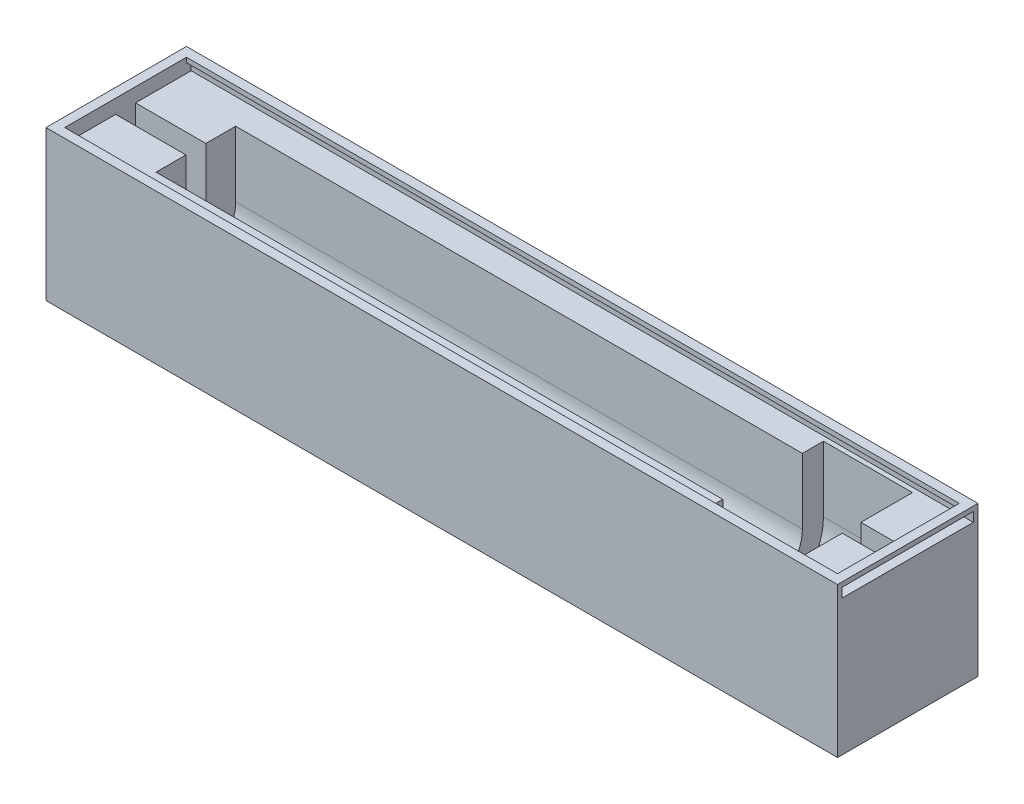
ISO-10303-21;
HEADER;
FILE_DESCRIPTION(('STEP AP214'),'2;1');
FILE_NAME('part.step','',(''),(''),'','','');
FILE_SCHEMA(('AUTOMOTIVE_DESIGN { 1 0 10303 214 1 1 1 1 }'));
ENDSEC;
DATA;
#1=APPLICATION_CONTEXT('core data for automotive mechanical design processes');
#2=APPLICATION_PROTOCOL_DEFINITION('international standard','automotive_design',2000,#1);
#3=PRODUCT_CONTEXT('',#1,'mechanical');
#4=PRODUCT('Part','Part','',(#3));
#5=PRODUCT_RELATED_PRODUCT_CATEGORY('part','',(#4));
#6=PRODUCT_DEFINITION_FORMATION('','',#4);
#7=PRODUCT_DEFINITION_CONTEXT('part definition',#1,'design');
#8=PRODUCT_DEFINITION('design','',#6,#7);
#9=PRODUCT_DEFINITION_SHAPE('','',#8);
#10=(LENGTH_UNIT() NAMED_UNIT(*) SI_UNIT(.MILLI.,.METRE.));
#11=(NAMED_UNIT(*) PLANE_ANGLE_UNIT() SI_UNIT($,.RADIAN.));
#12=(NAMED_UNIT(*) SI_UNIT($,.STERADIAN.) SOLID_ANGLE_UNIT());
#13=UNCERTAINTY_MEASURE_WITH_UNIT(LENGTH_MEASURE(1.E-05),#10,'distance_accuracy_value','');
#14=(GEOMETRIC_REPRESENTATION_CONTEXT(3) GLOBAL_UNCERTAINTY_ASSIGNED_CONTEXT((#13)) GLOBAL_UNIT_ASSIGNED_CONTEXT((#10,
#11,#12)) REPRESENTATION_CONTEXT('',''));
#15=CARTESIAN_POINT('',(0.,0.,0.));
#16=DIRECTION('',(0.,0.,1.));
#17=DIRECTION('',(1.,0.,0.));
#18=AXIS2_PLACEMENT_3D('',#15,#16,#17);
#19=CARTESIAN_POINT('',(0.,0.,0.));
#20=DIRECTION('',(1.,0.,0.));
#21=DIRECTION('',(0.,0.,-1.));
#22=AXIS2_PLACEMENT_3D('',#19,#20,#21);
#23=CYLINDRICAL_SURFACE('',#22,2.125);
#24=CARTESIAN_POINT('',(15.,0.,0.));
#25=DIRECTION('',(1.,0.,0.));
#26=DIRECTION('',(0.,0.,-1.));
#27=AXIS2_PLACEMENT_3D('',#24,#25,#26);
#28=CIRCLE('',#27,2.125);
#29=CARTESIAN_POINT('',(15.,0.,2.125));
#30=VERTEX_POINT('',#29);
#31=CARTESIAN_POINT('',(15.,0.,-2.125));
#32=VERTEX_POINT('',#31);
#33=EDGE_CURVE('E428',#30,#32,#28,.T.);
#34=ORIENTED_EDGE('',*,*,#33,.T.);
#35=DIRECTION('',(1.,0.,0.));
#36=VECTOR('',#35,1.);
#37=CARTESIAN_POINT('',(0.,0.,-2.125));
#38=LINE('',#37,#36);
#39=CARTESIAN_POINT('',(0.,0.,-2.125));
#40=VERTEX_POINT('',#39);
#41=EDGE_CURVE('E441',#40,#32,#38,.T.);
#42=ORIENTED_EDGE('',*,*,#41,.F.);
#43=CARTESIAN_POINT('',(0.,0.,0.));
#44=DIRECTION('',(1.,0.,0.));
#45=DIRECTION('',(0.,0.,-1.));
#46=AXIS2_PLACEMENT_3D('',#43,#44,#45);
#47=CIRCLE('',#46,2.125);
#48=CARTESIAN_POINT('',(0.,0.,2.125));
#49=VERTEX_POINT('',#48);
#50=EDGE_CURVE('E429',#49,#40,#47,.T.);
#51=ORIENTED_EDGE('',*,*,#50,.F.);
#52=DIRECTION('',(1.,0.,0.));
#53=VECTOR('',#52,1.);
#54=CARTESIAN_POINT('',(0.,0.,2.125));
#55=LINE('',#54,#53);
#56=EDGE_CURVE('E451',#49,#30,#55,.T.);
#57=ORIENTED_EDGE('',*,*,#56,.T.);
#58=EDGE_LOOP('',(#34,#42,#51,#57));
#59=FACE_BOUND('',#58,.T.);
#60=ADVANCED_FACE('F47',(#59),#23,.F.);
#61=CARTESIAN_POINT('',(15.,0.,0.));
#62=DIRECTION('',(1.,0.,0.));
#63=DIRECTION('',(0.,0.,-1.));
#64=AXIS2_PLACEMENT_3D('',#61,#62,#63);
#65=CYLINDRICAL_SURFACE('',#64,8.5);
#66=CARTESIAN_POINT('',(136.,0.,0.));
#67=DIRECTION('',(1.,0.,0.));
#68=DIRECTION('',(0.,0.,-1.));
#69=AXIS2_PLACEMENT_3D('',#66,#67,#68);
#70=CIRCLE('',#69,8.5);
#71=CARTESIAN_POINT('',(136.,0.,8.5));
#72=VERTEX_POINT('',#71);
#73=CARTESIAN_POINT('',(136.,0.,-8.5));
#74=VERTEX_POINT('',#73);
#75=EDGE_CURVE('E389',#72,#74,#70,.T.);
#76=ORIENTED_EDGE('',*,*,#75,.T.);
#77=DIRECTION('',(1.,0.,0.));
#78=VECTOR('',#77,1.);
#79=CARTESIAN_POINT('',(15.,0.,-8.5));
#80=LINE('',#79,#78);
#81=CARTESIAN_POINT('',(15.,0.,-8.5));
#82=VERTEX_POINT('',#81);
#83=EDGE_CURVE('E402',#82,#74,#80,.T.);
#84=ORIENTED_EDGE('',*,*,#83,.F.);
#85=CARTESIAN_POINT('',(15.,0.,0.));
#86=DIRECTION('',(1.,0.,0.));
#87=DIRECTION('',(0.,0.,-1.));
#88=AXIS2_PLACEMENT_3D('',#85,#86,#87);
#89=CIRCLE('',#88,8.5);
#90=CARTESIAN_POINT('',(15.,0.,8.5));
#91=VERTEX_POINT('',#90);
#92=EDGE_CURVE('E390',#91,#82,#89,.T.);
#93=ORIENTED_EDGE('',*,*,#92,.F.);
#94=DIRECTION('',(1.,0.,0.));
#95=VECTOR('',#94,1.);
#96=CARTESIAN_POINT('',(15.,0.,8.5));
#97=LINE('',#96,#95);
#98=EDGE_CURVE('E411',#91,#72,#97,.T.);
#99=ORIENTED_EDGE('',*,*,#98,.T.);
#100=EDGE_LOOP('',(#76,#84,#93,#99));
#101=FACE_BOUND('',#100,.T.);
#102=ADVANCED_FACE('F617',(#101),#65,.F.);
#103=CARTESIAN_POINT('',(165.,0.,0.));
#104=DIRECTION('',(-1.,0.,0.));
#105=DIRECTION('',(0.,0.,1.));
#106=AXIS2_PLACEMENT_3D('',#103,#104,#105);
#107=CYLINDRICAL_SURFACE('',#106,2.);
#108=CARTESIAN_POINT('',(155.,0.,0.));
#109=DIRECTION('',(-1.,0.,0.));
#110=DIRECTION('',(0.,0.,1.));
#111=AXIS2_PLACEMENT_3D('',#108,#109,#110);
#112=CIRCLE('',#111,2.);
#113=CARTESIAN_POINT('',(155.,0.,-2.));
#114=VERTEX_POINT('',#113);
#115=CARTESIAN_POINT('',(155.,0.,2.));
#116=VERTEX_POINT('',#115);
#117=EDGE_CURVE('E455',#114,#116,#112,.T.);
#118=ORIENTED_EDGE('',*,*,#117,.T.);
#119=DIRECTION('',(-1.,0.,0.));
#120=VECTOR('',#119,1.);
#121=CARTESIAN_POINT('',(165.,0.,2.));
#122=LINE('',#121,#120);
#123=CARTESIAN_POINT('',(165.,0.,2.));
#124=VERTEX_POINT('',#123);
#125=EDGE_CURVE('E471',#124,#116,#122,.T.);
#126=ORIENTED_EDGE('',*,*,#125,.F.);
#127=CARTESIAN_POINT('',(165.,0.,0.));
#128=DIRECTION('',(-1.,0.,0.));
#129=DIRECTION('',(0.,0.,1.));
#130=AXIS2_PLACEMENT_3D('',#127,#128,#129);
#131=CIRCLE('',#130,2.);
#132=CARTESIAN_POINT('',(165.,0.,-2.));
#133=VERTEX_POINT('',#132);
#134=EDGE_CURVE('E459',#133,#124,#131,.T.);
#135=ORIENTED_EDGE('',*,*,#134,.F.);
#136=DIRECTION('',(-1.,0.,0.));
#137=VECTOR('',#136,1.);
#138=CARTESIAN_POINT('',(165.,0.,-2.));
#139=LINE('',#138,#137);
#140=EDGE_CURVE('E480',#133,#114,#139,.T.);
#141=ORIENTED_EDGE('',*,*,#140,.T.);
#142=EDGE_LOOP('',(#118,#126,#135,#141));
#143=FACE_BOUND('',#142,.T.);
#144=ADVANCED_FACE('F560',(#143),#107,.F.);
#145=CARTESIAN_POINT('',(165.,0.,0.));
#146=DIRECTION('',(-1.,0.,0.));
#147=DIRECTION('',(0.,0.,1.));
#148=AXIS2_PLACEMENT_3D('',#145,#146,#147);
#149=CYLINDRICAL_SURFACE('',#148,13.);
#150=DIRECTION('',(-1.,0.,0.));
#151=VECTOR('',#150,1.);
#152=CARTESIAN_POINT('',(165.,0.,-13.));
#153=LINE('',#152,#151);
#154=CARTESIAN_POINT('',(155.,0.,-13.));
#155=VERTEX_POINT('',#154);
#156=CARTESIAN_POINT('',(136.,0.,-13.));
#157=VERTEX_POINT('',#156);
#158=EDGE_CURVE('E517',#155,#157,#153,.T.);
#159=ORIENTED_EDGE('',*,*,#158,.T.);
#160=CARTESIAN_POINT('',(136.,0.,0.));
#161=DIRECTION('',(1.,0.,0.));
#162=DIRECTION('',(0.,0.,-1.));
#163=AXIS2_PLACEMENT_3D('',#160,#161,#162);
#164=CIRCLE('',#163,13.);
#165=CARTESIAN_POINT('',(136.,0.,13.));
#166=VERTEX_POINT('',#165);
#167=EDGE_CURVE('E415',#166,#157,#164,.T.);
#168=ORIENTED_EDGE('',*,*,#167,.F.);
#169=DIRECTION('',(-1.,0.,0.));
#170=VECTOR('',#169,1.);
#171=CARTESIAN_POINT('',(165.,0.,13.));
#172=LINE('',#171,#170);
#173=CARTESIAN_POINT('',(155.,0.,13.));
#174=VERTEX_POINT('',#173);
#175=EDGE_CURVE('E56',#174,#166,#172,.T.);
#176=ORIENTED_EDGE('',*,*,#175,.F.);
#177=CARTESIAN_POINT('',(155.,0.,0.));
#178=DIRECTION('',(-1.,0.,0.));
#179=DIRECTION('',(0.,0.,-1.));
#180=AXIS2_PLACEMENT_3D('',#177,#178,#179);
#181=CIRCLE('',#180,13.);
#182=EDGE_CURVE('E490',#155,#174,#181,.T.);
#183=ORIENTED_EDGE('',*,*,#182,.F.);
#184=EDGE_LOOP('',(#159,#168,#176,#183));
#185=FACE_BOUND('',#184,.T.);
#186=ADVANCED_FACE('F49',(#185),#149,.F.);
#187=CARTESIAN_POINT('',(165.,0.,13.));
#188=DIRECTION('',(0.,0.,1.));
#189=DIRECTION('',(0.,-1.,0.));
#190=AXIS2_PLACEMENT_3D('',#187,#188,#189);
#191=PLANE('',#190);
#192=DIRECTION('',(0.,-1.,0.));
#193=VECTOR('',#192,1.);
#194=CARTESIAN_POINT('',(136.,17.,13.));
#195=LINE('',#194,#193);
#196=CARTESIAN_POINT('',(136.,14.,13.));
#197=VERTEX_POINT('',#196);
#198=EDGE_CURVE('E425',#197,#166,#195,.T.);
#199=ORIENTED_EDGE('',*,*,#198,.F.);
#200=DIRECTION('',(1.,0.,0.));
#201=VECTOR('',#200,1.);
#202=CARTESIAN_POINT('',(165.,14.,13.));
#203=LINE('',#202,#201);
#204=CARTESIAN_POINT('',(155.,14.,13.));
#205=VERTEX_POINT('',#204);
#206=EDGE_CURVE('E385',#197,#205,#203,.T.);
#207=ORIENTED_EDGE('',*,*,#206,.T.);
#208=DIRECTION('',(0.,1.,0.));
#209=VECTOR('',#208,1.);
#210=CARTESIAN_POINT('',(155.,17.,13.));
#211=LINE('',#210,#209);
#212=EDGE_CURVE('E493',#174,#205,#211,.T.);
#213=ORIENTED_EDGE('',*,*,#212,.F.);
#214=ORIENTED_EDGE('',*,*,#175,.T.);
#215=EDGE_LOOP('',(#199,#207,#213,#214));
#216=FACE_BOUND('',#215,.T.);
#217=ADVANCED_FACE('F533',(#216),#191,.F.);
#218=CARTESIAN_POINT('',(155.,0.,0.));
#219=DIRECTION('',(1.,0.,0.));
#220=DIRECTION('',(0.,0.,-1.));
#221=AXIS2_PLACEMENT_3D('',#218,#219,#220);
#222=PLANE('',#221);
#223=ORIENTED_EDGE('',*,*,#212,.T.);
#224=DIRECTION('',(0.,0.,-1.));
#225=VECTOR('',#224,1.);
#226=CARTESIAN_POINT('',(155.,14.,0.));
#227=LINE('',#226,#225);
#228=CARTESIAN_POINT('',(155.,14.,2.));
#229=VERTEX_POINT('',#228);
#230=EDGE_CURVE('E369',#205,#229,#227,.T.);
#231=ORIENTED_EDGE('',*,*,#230,.T.);
#232=DIRECTION('',(0.,1.,0.));
#233=VECTOR('',#232,1.);
#234=CARTESIAN_POINT('',(155.,0.,2.));
#235=LINE('',#234,#233);
#236=EDGE_CURVE('E474',#116,#229,#235,.T.);
#237=ORIENTED_EDGE('',*,*,#236,.F.);
#238=ORIENTED_EDGE('',*,*,#117,.F.);
#239=DIRECTION('',(0.,-1.,0.));
#240=VECTOR('',#239,1.);
#241=CARTESIAN_POINT('',(155.,0.,-2.));
#242=LINE('',#241,#240);
#243=CARTESIAN_POINT('',(155.,14.,-2.));
#244=VERTEX_POINT('',#243);
#245=EDGE_CURVE('E464',#244,#114,#242,.T.);
#246=ORIENTED_EDGE('',*,*,#245,.F.);
#247=CARTESIAN_POINT('',(155.,14.,-13.));
#248=VERTEX_POINT('',#247);
#249=EDGE_CURVE('E365',#244,#248,#227,.T.);
#250=ORIENTED_EDGE('',*,*,#249,.T.);
#251=DIRECTION('',(0.,-1.,0.));
#252=VECTOR('',#251,1.);
#253=CARTESIAN_POINT('',(155.,17.,-13.));
#254=LINE('',#253,#252);
#255=EDGE_CURVE('E484',#248,#155,#254,.T.);
#256=ORIENTED_EDGE('',*,*,#255,.T.);
#257=ORIENTED_EDGE('',*,*,#182,.T.);
#258=EDGE_LOOP('',(#223,#231,#237,#238,#246,#250,#256,#257));
#259=FACE_BOUND('',#258,.T.);
#260=ADVANCED_FACE('F551',(#259),#222,.F.);
#261=CARTESIAN_POINT('',(165.,0.,2.));
#262=DIRECTION('',(0.,0.,1.));
#263=DIRECTION('',(0.,-1.,0.));
#264=AXIS2_PLACEMENT_3D('',#261,#262,#263);
#265=PLANE('',#264);
#266=ORIENTED_EDGE('',*,*,#236,.T.);
#267=DIRECTION('',(1.,0.,0.));
#268=VECTOR('',#267,1.);
#269=CARTESIAN_POINT('',(165.,14.,2.));
#270=LINE('',#269,#268);
#271=CARTESIAN_POINT('',(165.,14.,2.));
#272=VERTEX_POINT('',#271);
#273=EDGE_CURVE('E381',#229,#272,#270,.T.);
#274=ORIENTED_EDGE('',*,*,#273,.T.);
#275=DIRECTION('',(0.,1.,0.));
#276=VECTOR('',#275,1.);
#277=CARTESIAN_POINT('',(165.,0.,2.));
#278=LINE('',#277,#276);
#279=EDGE_CURVE('E463',#124,#272,#278,.T.);
#280=ORIENTED_EDGE('',*,*,#279,.F.);
#281=ORIENTED_EDGE('',*,*,#125,.T.);
#282=EDGE_LOOP('',(#266,#274,#280,#281));
#283=FACE_BOUND('',#282,.T.);
#284=ADVANCED_FACE('F567',(#283),#265,.F.);
#285=CARTESIAN_POINT('',(165.,0.,0.));
#286=DIRECTION('',(-1.,0.,0.));
#287=DIRECTION('',(0.,0.,1.));
#288=AXIS2_PLACEMENT_3D('',#285,#286,#287);
#289=PLANE('',#288);
#290=DIRECTION('',(0.,0.,1.));
#291=VECTOR('',#290,1.);
#292=CARTESIAN_POINT('',(165.,14.,0.));
#293=LINE('',#292,#291);
#294=CARTESIAN_POINT('',(165.,14.,-2.));
#295=VERTEX_POINT('',#294);
#296=EDGE_CURVE('E378',#295,#272,#293,.T.);
#297=ORIENTED_EDGE('',*,*,#296,.F.);
#298=DIRECTION('',(0.,-1.,0.));
#299=VECTOR('',#298,1.);
#300=CARTESIAN_POINT('',(165.,0.,-2.));
#301=LINE('',#300,#299);
#302=EDGE_CURVE('E468',#295,#133,#301,.T.);
#303=ORIENTED_EDGE('',*,*,#302,.T.);
#304=ORIENTED_EDGE('',*,*,#134,.T.);
#305=ORIENTED_EDGE('',*,*,#279,.T.);
#306=EDGE_LOOP('',(#297,#303,#304,#305));
#307=FACE_BOUND('',#306,.T.);
#308=ADVANCED_FACE('F564',(#307),#289,.T.);
#309=CARTESIAN_POINT('',(165.,0.,-2.));
#310=DIRECTION('',(0.,0.,-1.));
#311=DIRECTION('',(0.,1.,0.));
#312=AXIS2_PLACEMENT_3D('',#309,#310,#311);
#313=PLANE('',#312);
#314=ORIENTED_EDGE('',*,*,#302,.F.);
#315=DIRECTION('',(-1.,0.,0.));
#316=VECTOR('',#315,1.);
#317=CARTESIAN_POINT('',(165.,14.,-2.));
#318=LINE('',#317,#316);
#319=EDGE_CURVE('E370',#295,#244,#318,.T.);
#320=ORIENTED_EDGE('',*,*,#319,.T.);
#321=ORIENTED_EDGE('',*,*,#245,.T.);
#322=ORIENTED_EDGE('',*,*,#140,.F.);
#323=EDGE_LOOP('',(#314,#320,#321,#322));
#324=FACE_BOUND('',#323,.T.);
#325=ADVANCED_FACE('F557',(#324),#313,.F.);
#326=CARTESIAN_POINT('',(165.,0.,-13.));
#327=DIRECTION('',(0.,0.,-1.));
#328=DIRECTION('',(0.,1.,0.));
#329=AXIS2_PLACEMENT_3D('',#326,#327,#328);
#330=PLANE('',#329);
#331=ORIENTED_EDGE('',*,*,#255,.F.);
#332=DIRECTION('',(-1.,0.,0.));
#333=VECTOR('',#332,1.);
#334=CARTESIAN_POINT('',(165.,14.,-13.));
#335=LINE('',#334,#333);
#336=CARTESIAN_POINT('',(136.,14.,-13.));
#337=VERTEX_POINT('',#336);
#338=EDGE_CURVE('E357',#248,#337,#335,.T.);
#339=ORIENTED_EDGE('',*,*,#338,.T.);
#340=DIRECTION('',(0.,1.,0.));
#341=VECTOR('',#340,1.);
#342=CARTESIAN_POINT('',(136.,0.,-13.));
#343=LINE('',#342,#341);
#344=EDGE_CURVE('E421',#157,#337,#343,.T.);
#345=ORIENTED_EDGE('',*,*,#344,.F.);
#346=ORIENTED_EDGE('',*,*,#158,.F.);
#347=EDGE_LOOP('',(#331,#339,#345,#346));
#348=FACE_BOUND('',#347,.T.);
#349=ADVANCED_FACE('F545',(#348),#330,.F.);
#350=CARTESIAN_POINT('',(136.,0.,0.));
#351=DIRECTION('',(1.,0.,0.));
#352=DIRECTION('',(0.,0.,-1.));
#353=AXIS2_PLACEMENT_3D('',#350,#351,#352);
#354=PLANE('',#353);
#355=DIRECTION('',(0.,0.,-1.));
#356=VECTOR('',#355,1.);
#357=CARTESIAN_POINT('',(136.,14.,0.));
#358=LINE('',#357,#356);
#359=CARTESIAN_POINT('',(136.,14.,8.5));
#360=VERTEX_POINT('',#359);
#361=EDGE_CURVE('E353',#197,#360,#358,.T.);
#362=ORIENTED_EDGE('',*,*,#361,.F.);
#363=ORIENTED_EDGE('',*,*,#198,.T.);
#364=ORIENTED_EDGE('',*,*,#167,.T.);
#365=ORIENTED_EDGE('',*,*,#344,.T.);
#366=CARTESIAN_POINT('',(136.,14.,-8.5));
#367=VERTEX_POINT('',#366);
#368=EDGE_CURVE('E348',#367,#337,#358,.T.);
#369=ORIENTED_EDGE('',*,*,#368,.F.);
#370=DIRECTION('',(0.,1.,0.));
#371=VECTOR('',#370,1.);
#372=CARTESIAN_POINT('',(136.,17.,-8.5));
#373=LINE('',#372,#371);
#374=EDGE_CURVE('E405',#74,#367,#373,.T.);
#375=ORIENTED_EDGE('',*,*,#374,.F.);
#376=ORIENTED_EDGE('',*,*,#75,.F.);
#377=DIRECTION('',(0.,-1.,0.));
#378=VECTOR('',#377,1.);
#379=CARTESIAN_POINT('',(136.,0.,8.5));
#380=LINE('',#379,#378);
#381=EDGE_CURVE('E395',#360,#72,#380,.T.);
#382=ORIENTED_EDGE('',*,*,#381,.F.);
#383=EDGE_LOOP('',(#362,#363,#364,#365,#369,#375,#376,#382));
#384=FACE_BOUND('',#383,.T.);
#385=ADVANCED_FACE('F541',(#384),#354,.T.);
#386=CARTESIAN_POINT('',(15.,17.,-8.5));
#387=DIRECTION('',(0.,0.,-1.));
#388=DIRECTION('',(-1.,0.,0.));
#389=AXIS2_PLACEMENT_3D('',#386,#387,#388);
#390=PLANE('',#389);
#391=ORIENTED_EDGE('',*,*,#374,.T.);
#392=DIRECTION('',(-1.,0.,0.));
#393=VECTOR('',#392,1.);
#394=CARTESIAN_POINT('',(15.,14.,-8.5));
#395=LINE('',#394,#393);
#396=CARTESIAN_POINT('',(15.,14.,-8.5));
#397=VERTEX_POINT('',#396);
#398=EDGE_CURVE('E11',#367,#397,#395,.T.);
#399=ORIENTED_EDGE('',*,*,#398,.T.);
#400=DIRECTION('',(0.,1.,0.));
#401=VECTOR('',#400,1.);
#402=CARTESIAN_POINT('',(15.,17.,-8.5));
#403=LINE('',#402,#401);
#404=EDGE_CURVE('E394',#82,#397,#403,.T.);
#405=ORIENTED_EDGE('',*,*,#404,.F.);
#406=ORIENTED_EDGE('',*,*,#83,.T.);
#407=EDGE_LOOP('',(#391,#399,#405,#406));
#408=FACE_BOUND('',#407,.T.);
#409=ADVANCED_FACE('F612',(#408),#390,.F.);
#410=CARTESIAN_POINT('',(15.,0.,0.));
#411=DIRECTION('',(1.,0.,0.));
#412=DIRECTION('',(0.,0.,-1.));
#413=AXIS2_PLACEMENT_3D('',#410,#411,#412);
#414=PLANE('',#413);
#415=DIRECTION('',(0.,0.,-1.));
#416=VECTOR('',#415,1.);
#417=CARTESIAN_POINT('',(15.,14.,0.));
#418=LINE('',#417,#416);
#419=CARTESIAN_POINT('',(15.,14.,8.5));
#420=VERTEX_POINT('',#419);
#421=CARTESIAN_POINT('',(15.,14.,2.125));
#422=VERTEX_POINT('',#421);
#423=EDGE_CURVE('E349',#420,#422,#418,.T.);
#424=ORIENTED_EDGE('',*,*,#423,.F.);
#425=DIRECTION('',(0.,-1.,0.));
#426=VECTOR('',#425,1.);
#427=CARTESIAN_POINT('',(15.,0.,8.5));
#428=LINE('',#427,#426);
#429=EDGE_CURVE('E399',#420,#91,#428,.T.);
#430=ORIENTED_EDGE('',*,*,#429,.T.);
#431=ORIENTED_EDGE('',*,*,#92,.T.);
#432=ORIENTED_EDGE('',*,*,#404,.T.);
#433=CARTESIAN_POINT('',(15.,14.,-2.125));
#434=VERTEX_POINT('',#433);
#435=EDGE_CURVE('E345',#434,#397,#418,.T.);
#436=ORIENTED_EDGE('',*,*,#435,.F.);
#437=DIRECTION('',(0.,1.,0.));
#438=VECTOR('',#437,1.);
#439=CARTESIAN_POINT('',(15.,17.,-2.125));
#440=LINE('',#439,#438);
#441=EDGE_CURVE('E445',#32,#434,#440,.T.);
#442=ORIENTED_EDGE('',*,*,#441,.F.);
#443=ORIENTED_EDGE('',*,*,#33,.F.);
#444=DIRECTION('',(0.,-1.,0.));
#445=VECTOR('',#444,1.);
#446=CARTESIAN_POINT('',(15.,0.,2.125));
#447=LINE('',#446,#445);
#448=EDGE_CURVE('E434',#422,#30,#447,.T.);
#449=ORIENTED_EDGE('',*,*,#448,.F.);
#450=EDGE_LOOP('',(#424,#430,#431,#432,#436,#442,#443,#449));
#451=FACE_BOUND('',#450,.T.);
#452=ADVANCED_FACE('F608',(#451),#414,.T.);
#453=CARTESIAN_POINT('',(0.,17.,-2.125));
#454=DIRECTION('',(0.,0.,-1.));
#455=DIRECTION('',(-1.,0.,0.));
#456=AXIS2_PLACEMENT_3D('',#453,#454,#455);
#457=PLANE('',#456);
#458=ORIENTED_EDGE('',*,*,#441,.T.);
#459=DIRECTION('',(-1.,0.,0.));
#460=VECTOR('',#459,1.);
#461=CARTESIAN_POINT('',(0.,14.,-2.125));
#462=LINE('',#461,#460);
#463=CARTESIAN_POINT('',(0.,14.,-2.125));
#464=VERTEX_POINT('',#463);
#465=EDGE_CURVE('E352',#434,#464,#462,.T.);
#466=ORIENTED_EDGE('',*,*,#465,.T.);
#467=DIRECTION('',(0.,1.,0.));
#468=VECTOR('',#467,1.);
#469=CARTESIAN_POINT('',(0.,17.,-2.125));
#470=LINE('',#469,#468);
#471=EDGE_CURVE('E433',#40,#464,#470,.T.);
#472=ORIENTED_EDGE('',*,*,#471,.F.);
#473=ORIENTED_EDGE('',*,*,#41,.T.);
#474=EDGE_LOOP('',(#458,#466,#472,#473));
#475=FACE_BOUND('',#474,.T.);
#476=ADVANCED_FACE('F604',(#475),#457,.F.);
#477=CARTESIAN_POINT('',(0.,0.,0.));
#478=DIRECTION('',(1.,0.,0.));
#479=DIRECTION('',(0.,0.,-1.));
#480=AXIS2_PLACEMENT_3D('',#477,#478,#479);
#481=PLANE('',#480);
#482=DIRECTION('',(0.,0.,-1.));
#483=VECTOR('',#482,1.);
#484=CARTESIAN_POINT('',(0.,14.,14.));
#485=LINE('',#484,#483);
#486=CARTESIAN_POINT('',(0.,14.,14.));
#487=VERTEX_POINT('',#486);
#488=CARTESIAN_POINT('',(0.,14.,2.125));
#489=VERTEX_POINT('',#488);
#490=EDGE_CURVE('E291',#487,#489,#485,.T.);
#491=ORIENTED_EDGE('',*,*,#490,.T.);
#492=DIRECTION('',(0.,-1.,0.));
#493=VECTOR('',#492,1.);
#494=CARTESIAN_POINT('',(0.,0.,2.125));
#495=LINE('',#494,#493);
#496=EDGE_CURVE('E438',#489,#49,#495,.T.);
#497=ORIENTED_EDGE('',*,*,#496,.T.);
#498=ORIENTED_EDGE('',*,*,#50,.T.);
#499=ORIENTED_EDGE('',*,*,#471,.T.);
#500=CARTESIAN_POINT('',(0.,14.,-14.));
#501=VERTEX_POINT('',#500);
#502=EDGE_CURVE('E289',#464,#501,#485,.T.);
#503=ORIENTED_EDGE('',*,*,#502,.T.);
#504=DIRECTION('',(0.,1.,0.));
#505=VECTOR('',#504,1.);
#506=CARTESIAN_POINT('',(0.,16.,-14.));
#507=LINE('',#506,#505);
#508=CARTESIAN_POINT('',(0.,16.,-14.));
#509=VERTEX_POINT('',#508);
#510=EDGE_CURVE('E294',#501,#509,#507,.T.);
#511=ORIENTED_EDGE('',*,*,#510,.T.);
#512=DIRECTION('',(0.,0.,1.));
#513=VECTOR('',#512,1.);
#514=CARTESIAN_POINT('',(0.,16.,14.));
#515=LINE('',#514,#513);
#516=CARTESIAN_POINT('',(0.,16.,-13.));
#517=VERTEX_POINT('',#516);
#518=EDGE_CURVE('E299',#509,#517,#515,.T.);
#519=ORIENTED_EDGE('',*,*,#518,.T.);
#520=DIRECTION('',(0.,1.,0.));
#521=VECTOR('',#520,1.);
#522=CARTESIAN_POINT('',(0.,14.,-13.));
#523=LINE('',#522,#521);
#524=CARTESIAN_POINT('',(0.,17.,-13.));
#525=VERTEX_POINT('',#524);
#526=EDGE_CURVE('E268',#517,#525,#523,.T.);
#527=ORIENTED_EDGE('',*,*,#526,.T.);
#528=DIRECTION('',(0.,0.,1.));
#529=VECTOR('',#528,1.);
#530=CARTESIAN_POINT('',(0.,17.,-13.));
#531=LINE('',#530,#529);
#532=CARTESIAN_POINT('',(0.,17.,13.));
#533=VERTEX_POINT('',#532);
#534=EDGE_CURVE('E71',#525,#533,#531,.T.);
#535=ORIENTED_EDGE('',*,*,#534,.T.);
#536=DIRECTION('',(0.,1.,0.));
#537=VECTOR('',#536,1.);
#538=CARTESIAN_POINT('',(0.,14.,13.));
#539=LINE('',#538,#537);
#540=CARTESIAN_POINT('',(0.,16.,13.));
#541=VERTEX_POINT('',#540);
#542=EDGE_CURVE('E250',#541,#533,#539,.T.);
#543=ORIENTED_EDGE('',*,*,#542,.F.);
#544=CARTESIAN_POINT('',(0.,16.,14.));
#545=VERTEX_POINT('',#544);
#546=EDGE_CURVE('E298',#541,#545,#515,.T.);
#547=ORIENTED_EDGE('',*,*,#546,.T.);
#548=DIRECTION('',(0.,-1.,0.));
#549=VECTOR('',#548,1.);
#550=CARTESIAN_POINT('',(0.,16.,14.));
#551=LINE('',#550,#549);
#552=EDGE_CURVE('E285',#545,#487,#551,.T.);
#553=ORIENTED_EDGE('',*,*,#552,.T.);
#554=EDGE_LOOP('',(#491,#497,#498,#499,#503,#511,#519,#527,#535,#543,#547,#553));
#555=FACE_BOUND('',#554,.T.);
#556=ADVANCED_FACE('F573',(#555),#481,.T.);
#557=CARTESIAN_POINT('',(0.,0.,2.125));
#558=DIRECTION('',(0.,0.,1.));
#559=DIRECTION('',(1.,0.,0.));
#560=AXIS2_PLACEMENT_3D('',#557,#558,#559);
#561=PLANE('',#560);
#562=ORIENTED_EDGE('',*,*,#496,.F.);
#563=DIRECTION('',(1.,0.,0.));
#564=VECTOR('',#563,1.);
#565=CARTESIAN_POINT('',(0.,14.,2.125));
#566=LINE('',#565,#564);
#567=EDGE_CURVE('E361',#489,#422,#566,.T.);
#568=ORIENTED_EDGE('',*,*,#567,.T.);
#569=ORIENTED_EDGE('',*,*,#448,.T.);
#570=ORIENTED_EDGE('',*,*,#56,.F.);
#571=EDGE_LOOP('',(#562,#568,#569,#570));
#572=FACE_BOUND('',#571,.T.);
#573=ADVANCED_FACE('F599',(#572),#561,.F.);
#574=CARTESIAN_POINT('',(15.,0.,8.5));
#575=DIRECTION('',(0.,0.,1.));
#576=DIRECTION('',(1.,0.,0.));
#577=AXIS2_PLACEMENT_3D('',#574,#575,#576);
#578=PLANE('',#577);
#579=ORIENTED_EDGE('',*,*,#429,.F.);
#580=DIRECTION('',(1.,0.,0.));
#581=VECTOR('',#580,1.);
#582=CARTESIAN_POINT('',(15.,14.,8.5));
#583=LINE('',#582,#581);
#584=EDGE_CURVE('E374',#420,#360,#583,.T.);
#585=ORIENTED_EDGE('',*,*,#584,.T.);
#586=ORIENTED_EDGE('',*,*,#381,.T.);
#587=ORIENTED_EDGE('',*,*,#98,.F.);
#588=EDGE_LOOP('',(#579,#585,#586,#587));
#589=FACE_BOUND('',#588,.T.);
#590=ADVANCED_FACE('F621',(#589),#578,.F.);
#591=CARTESIAN_POINT('',(0.,14.,14.));
#592=DIRECTION('',(0.,-1.,0.));
#593=DIRECTION('',(0.,0.,-1.));
#594=AXIS2_PLACEMENT_3D('',#591,#592,#593);
#595=PLANE('',#594);
#596=DIRECTION('',(1.,0.,0.));
#597=VECTOR('',#596,1.);
#598=CARTESIAN_POINT('',(0.,14.,-14.));
#599=LINE('',#598,#597);
#600=CARTESIAN_POINT('',(167.,14.,-14.));
#601=VERTEX_POINT('',#600);
#602=EDGE_CURVE('E324',#501,#601,#599,.T.);
#603=ORIENTED_EDGE('',*,*,#602,.F.);
#604=ORIENTED_EDGE('',*,*,#502,.F.);
#605=ORIENTED_EDGE('',*,*,#465,.F.);
#606=ORIENTED_EDGE('',*,*,#435,.T.);
#607=ORIENTED_EDGE('',*,*,#398,.F.);
#608=ORIENTED_EDGE('',*,*,#368,.T.);
#609=ORIENTED_EDGE('',*,*,#338,.F.);
#610=ORIENTED_EDGE('',*,*,#249,.F.);
#611=ORIENTED_EDGE('',*,*,#319,.F.);
#612=ORIENTED_EDGE('',*,*,#296,.T.);
#613=ORIENTED_EDGE('',*,*,#273,.F.);
#614=ORIENTED_EDGE('',*,*,#230,.F.);
#615=ORIENTED_EDGE('',*,*,#206,.F.);
#616=ORIENTED_EDGE('',*,*,#361,.T.);
#617=ORIENTED_EDGE('',*,*,#584,.F.);
#618=ORIENTED_EDGE('',*,*,#423,.T.);
#619=ORIENTED_EDGE('',*,*,#567,.F.);
#620=ORIENTED_EDGE('',*,*,#490,.F.);
#621=DIRECTION('',(1.,0.,0.));
#622=VECTOR('',#621,1.);
#623=CARTESIAN_POINT('',(0.,14.,14.));
#624=LINE('',#623,#622);
#625=CARTESIAN_POINT('',(167.,14.,14.));
#626=VERTEX_POINT('',#625);
#627=EDGE_CURVE('E303',#487,#626,#624,.T.);
#628=ORIENTED_EDGE('',*,*,#627,.T.);
#629=DIRECTION('',(0.,0.,-1.));
#630=VECTOR('',#629,1.);
#631=CARTESIAN_POINT('',(167.,14.,14.));
#632=LINE('',#631,#630);
#633=EDGE_CURVE('E306',#626,#601,#632,.T.);
#634=ORIENTED_EDGE('',*,*,#633,.T.);
#635=EDGE_LOOP('',(#603,#604,#605,#606,#607,#608,#609,#610,#611,#612,#613,#614,#615,#616,#617,
#618,#619,#620,#628,#634));
#636=FACE_BOUND('',#635,.T.);
#637=ADVANCED_FACE('F548',(#636),#595,.F.);
#638=CARTESIAN_POINT('',(0.,16.,14.));
#639=DIRECTION('',(0.,0.,1.));
#640=DIRECTION('',(1.,0.,0.));
#641=AXIS2_PLACEMENT_3D('',#638,#639,#640);
#642=PLANE('',#641);
#643=DIRECTION('',(0.,-1.,0.));
#644=VECTOR('',#643,1.);
#645=CARTESIAN_POINT('',(167.,16.,14.));
#646=LINE('',#645,#644);
#647=CARTESIAN_POINT('',(167.,16.,14.));
#648=VERTEX_POINT('',#647);
#649=EDGE_CURVE('E284',#648,#626,#646,.T.);
#650=ORIENTED_EDGE('',*,*,#649,.T.);
#651=ORIENTED_EDGE('',*,*,#627,.F.);
#652=ORIENTED_EDGE('',*,*,#552,.F.);
#653=DIRECTION('',(1.,0.,0.));
#654=VECTOR('',#653,1.);
#655=CARTESIAN_POINT('',(0.,16.,14.));
#656=LINE('',#655,#654);
#657=EDGE_CURVE('E317',#545,#648,#656,.T.);
#658=ORIENTED_EDGE('',*,*,#657,.T.);
#659=EDGE_LOOP('',(#650,#651,#652,#658));
#660=FACE_BOUND('',#659,.T.);
#661=ADVANCED_FACE('F592',(#660),#642,.F.);
#662=CARTESIAN_POINT('',(0.,16.,14.));
#663=DIRECTION('',(0.,1.,0.));
#664=DIRECTION('',(0.,0.,1.));
#665=AXIS2_PLACEMENT_3D('',#662,#663,#664);
#666=PLANE('',#665);
#667=DIRECTION('',(0.,0.,-1.));
#668=VECTOR('',#667,1.);
#669=CARTESIAN_POINT('',(165.,16.,14.));
#670=LINE('',#669,#668);
#671=CARTESIAN_POINT('',(165.,16.,13.));
#672=VERTEX_POINT('',#671);
#673=CARTESIAN_POINT('',(165.,16.,-13.));
#674=VERTEX_POINT('',#673);
#675=EDGE_CURVE('E246',#672,#674,#670,.T.);
#676=ORIENTED_EDGE('',*,*,#675,.T.);
#677=DIRECTION('',(-1.,0.,0.));
#678=VECTOR('',#677,1.);
#679=CARTESIAN_POINT('',(0.,16.,-13.));
#680=LINE('',#679,#678);
#681=EDGE_CURVE('E280',#674,#517,#680,.T.);
#682=ORIENTED_EDGE('',*,*,#681,.T.);
#683=ORIENTED_EDGE('',*,*,#518,.F.);
#684=DIRECTION('',(1.,0.,0.));
#685=VECTOR('',#684,1.);
#686=CARTESIAN_POINT('',(0.,16.,-14.));
#687=LINE('',#686,#685);
#688=CARTESIAN_POINT('',(167.,16.,-14.));
#689=VERTEX_POINT('',#688);
#690=EDGE_CURVE('E321',#509,#689,#687,.T.);
#691=ORIENTED_EDGE('',*,*,#690,.T.);
#692=DIRECTION('',(0.,0.,1.));
#693=VECTOR('',#692,1.);
#694=CARTESIAN_POINT('',(167.,16.,14.));
#695=LINE('',#694,#693);
#696=EDGE_CURVE('E290',#689,#648,#695,.T.);
#697=ORIENTED_EDGE('',*,*,#696,.T.);
#698=ORIENTED_EDGE('',*,*,#657,.F.);
#699=ORIENTED_EDGE('',*,*,#546,.F.);
#700=DIRECTION('',(1.,0.,0.));
#701=VECTOR('',#700,1.);
#702=CARTESIAN_POINT('',(0.,16.,13.));
#703=LINE('',#702,#701);
#704=EDGE_CURVE('E271',#541,#672,#703,.T.);
#705=ORIENTED_EDGE('',*,*,#704,.T.);
#706=EDGE_LOOP('',(#676,#682,#683,#691,#697,#698,#699,#705));
#707=FACE_BOUND('',#706,.T.);
#708=ADVANCED_FACE('F583',(#707),#666,.F.);
#709=CARTESIAN_POINT('',(0.,16.,-14.));
#710=DIRECTION('',(0.,0.,-1.));
#711=DIRECTION('',(-1.,0.,0.));
#712=AXIS2_PLACEMENT_3D('',#709,#710,#711);
#713=PLANE('',#712);
#714=DIRECTION('',(0.,1.,0.));
#715=VECTOR('',#714,1.);
#716=CARTESIAN_POINT('',(167.,16.,-14.));
#717=LINE('',#716,#715);
#718=EDGE_CURVE('E310',#601,#689,#717,.T.);
#719=ORIENTED_EDGE('',*,*,#718,.T.);
#720=ORIENTED_EDGE('',*,*,#690,.F.);
#721=ORIENTED_EDGE('',*,*,#510,.F.);
#722=ORIENTED_EDGE('',*,*,#602,.T.);
#723=EDGE_LOOP('',(#719,#720,#721,#722));
#724=FACE_BOUND('',#723,.T.);
#725=ADVANCED_FACE('F580',(#724),#713,.F.);
#726=CARTESIAN_POINT('',(165.,17.,15.));
#727=DIRECTION('',(0.,0.,-1.));
#728=DIRECTION('',(0.,1.,0.));
#729=AXIS2_PLACEMENT_3D('',#726,#727,#728);
#730=PLANE('',#729);
#731=DIRECTION('',(0.,-1.,0.));
#732=VECTOR('',#731,1.);
#733=CARTESIAN_POINT('',(167.,-15.,15.));
#734=LINE('',#733,#732);
#735=CARTESIAN_POINT('',(167.,17.,15.));
#736=VERTEX_POINT('',#735);
#737=CARTESIAN_POINT('',(167.,-15.,15.));
#738=VERTEX_POINT('',#737);
#739=EDGE_CURVE('E507',#736,#738,#734,.T.);
#740=ORIENTED_EDGE('',*,*,#739,.F.);
#741=DIRECTION('',(1.,0.,0.));
#742=VECTOR('',#741,1.);
#743=CARTESIAN_POINT('',(-2.,17.,15.));
#744=LINE('',#743,#742);
#745=CARTESIAN_POINT('',(-2.,17.,15.));
#746=VERTEX_POINT('',#745);
#747=EDGE_CURVE('E333',#746,#736,#744,.T.);
#748=ORIENTED_EDGE('',*,*,#747,.F.);
#749=DIRECTION('',(0.,1.,0.));
#750=VECTOR('',#749,1.);
#751=CARTESIAN_POINT('',(-2.,-15.,15.));
#752=LINE('',#751,#750);
#753=CARTESIAN_POINT('',(-2.,-15.,15.));
#754=VERTEX_POINT('',#753);
#755=EDGE_CURVE('E504',#754,#746,#752,.T.);
#756=ORIENTED_EDGE('',*,*,#755,.F.);
#757=DIRECTION('',(-1.,0.,0.));
#758=VECTOR('',#757,1.);
#759=CARTESIAN_POINT('',(165.,-15.,15.));
#760=LINE('',#759,#758);
#761=EDGE_CURVE('E525',#738,#754,#760,.T.);
#762=ORIENTED_EDGE('',*,*,#761,.F.);
#763=EDGE_LOOP('',(#740,#748,#756,#762));
#764=FACE_BOUND('',#763,.T.);
#765=ADVANCED_FACE('F667',(#764),#730,.F.);
#766=CARTESIAN_POINT('',(165.,-15.,15.));
#767=DIRECTION('',(0.,1.,0.));
#768=DIRECTION('',(0.,0.,1.));
#769=AXIS2_PLACEMENT_3D('',#766,#767,#768);
#770=PLANE('',#769);
#771=ORIENTED_EDGE('',*,*,#761,.T.);
#772=DIRECTION('',(0.,0.,1.));
#773=VECTOR('',#772,1.);
#774=CARTESIAN_POINT('',(-2.,-15.,-15.));
#775=LINE('',#774,#773);
#776=CARTESIAN_POINT('',(-2.,-15.,-15.));
#777=VERTEX_POINT('',#776);
#778=EDGE_CURVE('E500',#777,#754,#775,.T.);
#779=ORIENTED_EDGE('',*,*,#778,.F.);
#780=DIRECTION('',(-1.,0.,0.));
#781=VECTOR('',#780,1.);
#782=CARTESIAN_POINT('',(165.,-15.,-15.));
#783=LINE('',#782,#781);
#784=CARTESIAN_POINT('',(167.,-15.,-15.));
#785=VERTEX_POINT('',#784);
#786=EDGE_CURVE('E521',#785,#777,#783,.T.);
#787=ORIENTED_EDGE('',*,*,#786,.F.);
#788=DIRECTION('',(0.,0.,-1.));
#789=VECTOR('',#788,1.);
#790=CARTESIAN_POINT('',(167.,-15.,15.));
#791=LINE('',#790,#789);
#792=EDGE_CURVE('E510',#738,#785,#791,.T.);
#793=ORIENTED_EDGE('',*,*,#792,.F.);
#794=EDGE_LOOP('',(#771,#779,#787,#793));
#795=FACE_BOUND('',#794,.T.);
#796=ADVANCED_FACE('F663',(#795),#770,.F.);
#797=CARTESIAN_POINT('',(165.,17.,-15.));
#798=DIRECTION('',(0.,0.,1.));
#799=DIRECTION('',(0.,-1.,0.));
#800=AXIS2_PLACEMENT_3D('',#797,#798,#799);
#801=PLANE('',#800);
#802=DIRECTION('',(0.,-1.,0.));
#803=VECTOR('',#802,1.);
#804=CARTESIAN_POINT('',(-2.,-15.,-15.));
#805=LINE('',#804,#803);
#806=CARTESIAN_POINT('',(-2.,17.,-15.));
#807=VERTEX_POINT('',#806);
#808=EDGE_CURVE('E497',#807,#777,#805,.T.);
#809=ORIENTED_EDGE('',*,*,#808,.F.);
#810=DIRECTION('',(-1.,0.,0.));
#811=VECTOR('',#810,1.);
#812=CARTESIAN_POINT('',(-2.,17.,-15.));
#813=LINE('',#812,#811);
#814=CARTESIAN_POINT('',(167.,17.,-15.));
#815=VERTEX_POINT('',#814);
#816=EDGE_CURVE('E341',#815,#807,#813,.T.);
#817=ORIENTED_EDGE('',*,*,#816,.F.);
#818=DIRECTION('',(0.,1.,0.));
#819=VECTOR('',#818,1.);
#820=CARTESIAN_POINT('',(167.,-15.,-15.));
#821=LINE('',#820,#819);
#822=EDGE_CURVE('E514',#785,#815,#821,.T.);
#823=ORIENTED_EDGE('',*,*,#822,.F.);
#824=ORIENTED_EDGE('',*,*,#786,.T.);
#825=EDGE_LOOP('',(#809,#817,#823,#824));
#826=FACE_BOUND('',#825,.T.);
#827=ADVANCED_FACE('F657',(#826),#801,.F.);
#828=CARTESIAN_POINT('',(167.,0.,0.));
#829=DIRECTION('',(-1.,0.,0.));
#830=DIRECTION('',(0.,0.,1.));
#831=AXIS2_PLACEMENT_3D('',#828,#829,#830);
#832=PLANE('',#831);
#833=ORIENTED_EDGE('',*,*,#633,.F.);
#834=ORIENTED_EDGE('',*,*,#649,.F.);
#835=ORIENTED_EDGE('',*,*,#696,.F.);
#836=ORIENTED_EDGE('',*,*,#718,.F.);
#837=EDGE_LOOP('',(#833,#834,#835,#836));
#838=FACE_BOUND('',#837,.T.);
#839=ORIENTED_EDGE('',*,*,#822,.T.);
#840=DIRECTION('',(0.,0.,-1.));
#841=VECTOR('',#840,1.);
#842=CARTESIAN_POINT('',(167.,17.,15.));
#843=LINE('',#842,#841);
#844=EDGE_CURVE('E337',#736,#815,#843,.T.);
#845=ORIENTED_EDGE('',*,*,#844,.F.);
#846=ORIENTED_EDGE('',*,*,#739,.T.);
#847=ORIENTED_EDGE('',*,*,#792,.T.);
#848=EDGE_LOOP('',(#839,#845,#846,#847));
#849=FACE_BOUND('',#848,.T.);
#850=ADVANCED_FACE('F653',(#838,#849),#832,.F.);
#851=CARTESIAN_POINT('',(-2.,0.,0.));
#852=DIRECTION('',(1.,0.,0.));
#853=DIRECTION('',(0.,0.,-1.));
#854=AXIS2_PLACEMENT_3D('',#851,#852,#853);
#855=PLANE('',#854);
#856=ORIENTED_EDGE('',*,*,#755,.T.);
#857=DIRECTION('',(0.,0.,1.));
#858=VECTOR('',#857,1.);
#859=CARTESIAN_POINT('',(-2.,17.,15.));
#860=LINE('',#859,#858);
#861=EDGE_CURVE('E320',#807,#746,#860,.T.);
#862=ORIENTED_EDGE('',*,*,#861,.F.);
#863=ORIENTED_EDGE('',*,*,#808,.T.);
#864=ORIENTED_EDGE('',*,*,#778,.T.);
#865=EDGE_LOOP('',(#856,#862,#863,#864));
#866=FACE_BOUND('',#865,.T.);
#867=ADVANCED_FACE('F650',(#866),#855,.F.);
#868=CARTESIAN_POINT('',(0.,17.,0.));
#869=DIRECTION('',(0.,-1.,0.));
#870=DIRECTION('',(0.,0.,-1.));
#871=AXIS2_PLACEMENT_3D('',#868,#869,#870);
#872=PLANE('',#871);
#873=DIRECTION('',(1.,0.,0.));
#874=VECTOR('',#873,1.);
#875=CARTESIAN_POINT('',(0.,17.,13.));
#876=LINE('',#875,#874);
#877=CARTESIAN_POINT('',(165.,17.,13.));
#878=VERTEX_POINT('',#877);
#879=EDGE_CURVE('E253',#533,#878,#876,.T.);
#880=ORIENTED_EDGE('',*,*,#879,.F.);
#881=ORIENTED_EDGE('',*,*,#534,.F.);
#882=DIRECTION('',(-1.,0.,0.));
#883=VECTOR('',#882,1.);
#884=CARTESIAN_POINT('',(0.,17.,-13.));
#885=LINE('',#884,#883);
#886=CARTESIAN_POINT('',(165.,17.,-13.));
#887=VERTEX_POINT('',#886);
#888=EDGE_CURVE('E261',#887,#525,#885,.T.);
#889=ORIENTED_EDGE('',*,*,#888,.F.);
#890=DIRECTION('',(0.,0.,-1.));
#891=VECTOR('',#890,1.);
#892=CARTESIAN_POINT('',(165.,17.,-13.));
#893=LINE('',#892,#891);
#894=EDGE_CURVE('E243',#878,#887,#893,.T.);
#895=ORIENTED_EDGE('',*,*,#894,.F.);
#896=EDGE_LOOP('',(#880,#881,#889,#895));
#897=FACE_BOUND('',#896,.T.);
#898=ORIENTED_EDGE('',*,*,#861,.T.);
#899=ORIENTED_EDGE('',*,*,#747,.T.);
#900=ORIENTED_EDGE('',*,*,#844,.T.);
#901=ORIENTED_EDGE('',*,*,#816,.T.);
#902=EDGE_LOOP('',(#898,#899,#900,#901));
#903=FACE_BOUND('',#902,.T.);
#904=ADVANCED_FACE('F258',(#897,#903),#872,.F.);
#905=CARTESIAN_POINT('',(0.,14.,-13.));
#906=DIRECTION('',(0.,0.,-1.));
#907=DIRECTION('',(-1.,0.,0.));
#908=AXIS2_PLACEMENT_3D('',#905,#906,#907);
#909=PLANE('',#908);
#910=DIRECTION('',(0.,1.,0.));
#911=VECTOR('',#910,1.);
#912=CARTESIAN_POINT('',(165.,14.,-13.));
#913=LINE('',#912,#911);
#914=EDGE_CURVE('E249',#674,#887,#913,.T.);
#915=ORIENTED_EDGE('',*,*,#914,.T.);
#916=ORIENTED_EDGE('',*,*,#888,.T.);
#917=ORIENTED_EDGE('',*,*,#526,.F.);
#918=ORIENTED_EDGE('',*,*,#681,.F.);
#919=EDGE_LOOP('',(#915,#916,#917,#918));
#920=FACE_BOUND('',#919,.T.);
#921=ADVANCED_FACE('F587',(#920),#909,.F.);
#922=CARTESIAN_POINT('',(165.,14.,-13.));
#923=DIRECTION('',(1.,0.,0.));
#924=DIRECTION('',(0.,0.,-1.));
#925=AXIS2_PLACEMENT_3D('',#922,#923,#924);
#926=PLANE('',#925);
#927=DIRECTION('',(0.,1.,0.));
#928=VECTOR('',#927,1.);
#929=CARTESIAN_POINT('',(165.,14.,13.));
#930=LINE('',#929,#928);
#931=EDGE_CURVE('E63',#672,#878,#930,.T.);
#932=ORIENTED_EDGE('',*,*,#931,.T.);
#933=ORIENTED_EDGE('',*,*,#894,.T.);
#934=ORIENTED_EDGE('',*,*,#914,.F.);
#935=ORIENTED_EDGE('',*,*,#675,.F.);
#936=EDGE_LOOP('',(#932,#933,#934,#935));
#937=FACE_BOUND('',#936,.T.);
#938=ADVANCED_FACE('F240',(#937),#926,.F.);
#939=CARTESIAN_POINT('',(0.,14.,13.));
#940=DIRECTION('',(0.,0.,1.));
#941=DIRECTION('',(1.,0.,0.));
#942=AXIS2_PLACEMENT_3D('',#939,#940,#941);
#943=PLANE('',#942);
#944=ORIENTED_EDGE('',*,*,#542,.T.);
#945=ORIENTED_EDGE('',*,*,#879,.T.);
#946=ORIENTED_EDGE('',*,*,#931,.F.);
#947=ORIENTED_EDGE('',*,*,#704,.F.);
#948=EDGE_LOOP('',(#944,#945,#946,#947));
#949=FACE_BOUND('',#948,.T.);
#950=ADVANCED_FACE('F254',(#949),#943,.F.);
#951=CLOSED_SHELL('',(#60,#102,#144,#186,#217,#260,#284,#308,#325,#349,#385,#409,#452,#476,#556,
#573,#590,#637,#661,#708,#725,#765,#796,#827,#850,#867,#904,#921,#938,#950));
#952=MANIFOLD_SOLID_BREP('B2',#951);
#953=ADVANCED_BREP_SHAPE_REPRESENTATION('',(#18,#952),#14);
#954=SHAPE_DEFINITION_REPRESENTATION(#9,#953);
ENDSEC;
END-ISO-10303-21;
